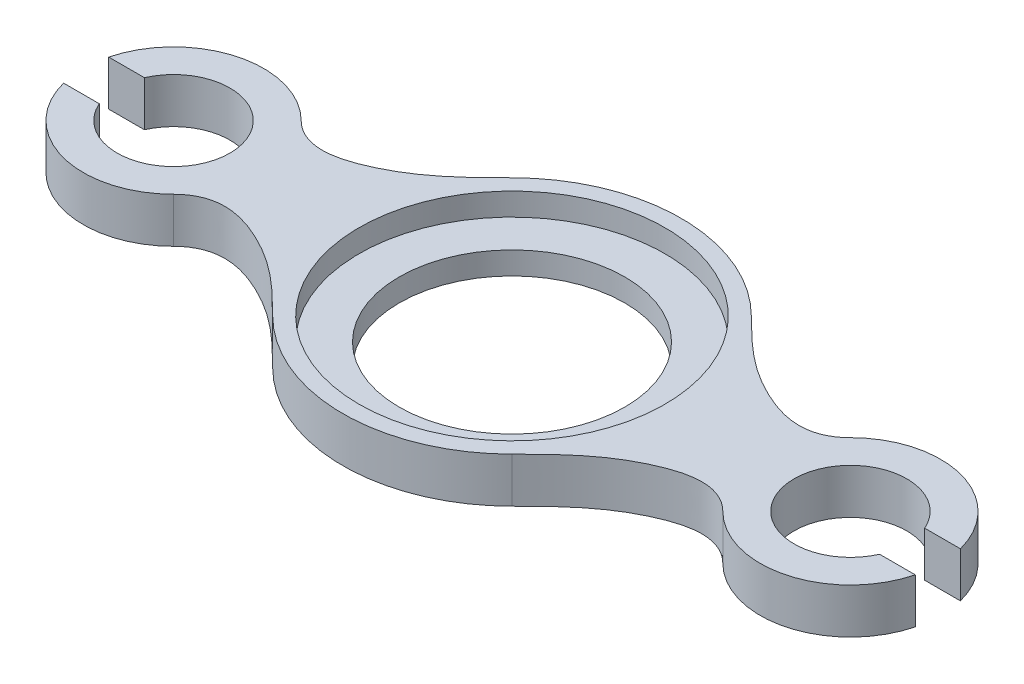
ISO-10303-21;
HEADER;
FILE_DESCRIPTION(('STEP AP214'),'2;1');
FILE_NAME('part.step','',(''),(''),'','','');
FILE_SCHEMA(('AUTOMOTIVE_DESIGN { 1 0 10303 214 1 1 1 1 }'));
ENDSEC;
DATA;
#1=APPLICATION_CONTEXT('core data for automotive mechanical design processes');
#2=APPLICATION_PROTOCOL_DEFINITION('international standard','automotive_design',2000,#1);
#3=PRODUCT_CONTEXT('',#1,'mechanical');
#4=PRODUCT('Part','Part','',(#3));
#5=PRODUCT_RELATED_PRODUCT_CATEGORY('part','',(#4));
#6=PRODUCT_DEFINITION_FORMATION('','',#4);
#7=PRODUCT_DEFINITION_CONTEXT('part definition',#1,'design');
#8=PRODUCT_DEFINITION('design','',#6,#7);
#9=PRODUCT_DEFINITION_SHAPE('','',#8);
#10=(LENGTH_UNIT() NAMED_UNIT(*) SI_UNIT(.MILLI.,.METRE.));
#11=(NAMED_UNIT(*) PLANE_ANGLE_UNIT() SI_UNIT($,.RADIAN.));
#12=(NAMED_UNIT(*) SI_UNIT($,.STERADIAN.) SOLID_ANGLE_UNIT());
#13=UNCERTAINTY_MEASURE_WITH_UNIT(LENGTH_MEASURE(1.E-05),#10,'distance_accuracy_value','');
#14=(GEOMETRIC_REPRESENTATION_CONTEXT(3) GLOBAL_UNCERTAINTY_ASSIGNED_CONTEXT((#13)) GLOBAL_UNIT_ASSIGNED_CONTEXT((#10,
#11,#12)) REPRESENTATION_CONTEXT('',''));
#15=CARTESIAN_POINT('',(0.,0.,0.));
#16=DIRECTION('',(0.,0.,1.));
#17=DIRECTION('',(1.,0.,0.));
#18=AXIS2_PLACEMENT_3D('',#15,#16,#17);
#19=CARTESIAN_POINT('',(150.,0.,0.));
#20=DIRECTION('',(0.,1.,0.));
#21=DIRECTION('',(0.,0.,1.));
#22=AXIS2_PLACEMENT_3D('',#19,#20,#21);
#23=CYLINDRICAL_SURFACE('',#22,40.);
#24=DIRECTION('',(0.,1.,0.));
#25=VECTOR('',#24,1.);
#26=CARTESIAN_POINT('',(188.729833462074,0.,10.0000000000001));
#27=LINE('',#26,#25);
#28=CARTESIAN_POINT('',(188.729833462074,20.,10.0000000000001));
#29=VERTEX_POINT('',#28);
#30=CARTESIAN_POINT('',(188.729833462074,0.,10.0000000000001));
#31=VERTEX_POINT('',#30);
#32=EDGE_CURVE('E259',#29,#31,#27,.F.);
#33=ORIENTED_EDGE('',*,*,#32,.F.);
#34=CARTESIAN_POINT('',(150.,20.,0.));
#35=DIRECTION('',(0.,1.,0.));
#36=DIRECTION('',(0.,0.,1.));
#37=AXIS2_PLACEMENT_3D('',#34,#35,#36);
#38=CIRCLE('',#37,40.);
#39=CARTESIAN_POINT('',(121.715728752538,20.,28.2842712474618));
#40=VERTEX_POINT('',#39);
#41=EDGE_CURVE('E310',#40,#29,#38,.T.);
#42=ORIENTED_EDGE('',*,*,#41,.F.);
#43=DIRECTION('',(0.,1.,0.));
#44=VECTOR('',#43,1.);
#45=CARTESIAN_POINT('',(121.715728752538,0.,28.2842712474618));
#46=LINE('',#45,#44);
#47=CARTESIAN_POINT('',(121.715728752538,0.,28.2842712474618));
#48=VERTEX_POINT('',#47);
#49=EDGE_CURVE('E329',#48,#40,#46,.T.);
#50=ORIENTED_EDGE('',*,*,#49,.F.);
#51=CARTESIAN_POINT('',(150.,0.,0.));
#52=DIRECTION('',(0.,1.,0.));
#53=DIRECTION('',(0.,0.,1.));
#54=AXIS2_PLACEMENT_3D('',#51,#52,#53);
#55=CIRCLE('',#54,40.);
#56=EDGE_CURVE('E370',#48,#31,#55,.T.);
#57=ORIENTED_EDGE('',*,*,#56,.T.);
#58=EDGE_LOOP('',(#33,#42,#50,#57));
#59=FACE_BOUND('',#58,.T.);
#60=ADVANCED_FACE('F40',(#59),#23,.T.);
#61=CARTESIAN_POINT('',(-150.,0.,0.));
#62=DIRECTION('',(0.,1.,0.));
#63=DIRECTION('',(0.,0.,1.));
#64=AXIS2_PLACEMENT_3D('',#61,#62,#63);
#65=CYLINDRICAL_SURFACE('',#64,40.);
#66=CARTESIAN_POINT('',(-150.,20.,0.));
#67=DIRECTION('',(0.,1.,0.));
#68=DIRECTION('',(0.,0.,1.));
#69=AXIS2_PLACEMENT_3D('',#66,#67,#68);
#70=CIRCLE('',#69,40.);
#71=CARTESIAN_POINT('',(-121.715728752538,20.,28.2842712474618));
#72=VERTEX_POINT('',#71);
#73=CARTESIAN_POINT('',(-188.729833462074,20.,10.));
#74=VERTEX_POINT('',#73);
#75=EDGE_CURVE('E288',#72,#74,#70,.F.);
#76=ORIENTED_EDGE('',*,*,#75,.T.);
#77=DIRECTION('',(0.,1.,0.));
#78=VECTOR('',#77,1.);
#79=CARTESIAN_POINT('',(-188.729833462074,0.,10.));
#80=LINE('',#79,#78);
#81=CARTESIAN_POINT('',(-188.729833462074,0.,10.));
#82=VERTEX_POINT('',#81);
#83=EDGE_CURVE('E62',#74,#82,#80,.F.);
#84=ORIENTED_EDGE('',*,*,#83,.T.);
#85=CARTESIAN_POINT('',(-150.,0.,0.));
#86=DIRECTION('',(0.,1.,0.));
#87=DIRECTION('',(0.,0.,1.));
#88=AXIS2_PLACEMENT_3D('',#85,#86,#87);
#89=CIRCLE('',#88,40.);
#90=CARTESIAN_POINT('',(-121.715728752538,0.,28.2842712474618));
#91=VERTEX_POINT('',#90);
#92=EDGE_CURVE('E192',#91,#82,#89,.F.);
#93=ORIENTED_EDGE('',*,*,#92,.F.);
#94=DIRECTION('',(0.,1.,0.));
#95=VECTOR('',#94,1.);
#96=CARTESIAN_POINT('',(-121.715728752538,0.,28.2842712474618));
#97=LINE('',#96,#95);
#98=EDGE_CURVE('E340',#91,#72,#97,.T.);
#99=ORIENTED_EDGE('',*,*,#98,.T.);
#100=EDGE_LOOP('',(#76,#84,#93,#99));
#101=FACE_BOUND('',#100,.T.);
#102=ADVANCED_FACE('F226',(#101),#65,.T.);
#103=CARTESIAN_POINT('',(0.,10.,0.));
#104=DIRECTION('',(0.,1.,0.));
#105=DIRECTION('',(0.,0.,1.));
#106=AXIS2_PLACEMENT_3D('',#103,#104,#105);
#107=PLANE('',#106);
#108=CARTESIAN_POINT('',(0.,10.,0.));
#109=DIRECTION('',(0.,1.,0.));
#110=DIRECTION('',(0.,0.,1.));
#111=AXIS2_PLACEMENT_3D('',#108,#109,#110);
#112=CIRCLE('',#111,67.8);
#113=CARTESIAN_POINT('',(0.,10.,67.8));
#114=VERTEX_POINT('',#113);
#115=EDGE_CURVE('E331',#114,#114,#112,.T.);
#116=ORIENTED_EDGE('',*,*,#115,.T.);
#117=EDGE_LOOP('',(#116));
#118=FACE_BOUND('',#117,.T.);
#119=CARTESIAN_POINT('',(0.,10.,0.));
#120=DIRECTION('',(0.,1.,0.));
#121=DIRECTION('',(0.,0.,1.));
#122=AXIS2_PLACEMENT_3D('',#119,#120,#121);
#123=CIRCLE('',#122,50.);
#124=CARTESIAN_POINT('',(0.,10.,50.));
#125=VERTEX_POINT('',#124);
#126=EDGE_CURVE('E350',#125,#125,#123,.T.);
#127=ORIENTED_EDGE('',*,*,#126,.F.);
#128=EDGE_LOOP('',(#127));
#129=FACE_BOUND('',#128,.T.);
#130=ADVANCED_FACE('F224',(#118,#129),#107,.T.);
#131=CARTESIAN_POINT('',(0.,0.,0.));
#132=DIRECTION('',(0.,1.,0.));
#133=DIRECTION('',(0.,0.,1.));
#134=AXIS2_PLACEMENT_3D('',#131,#132,#133);
#135=PLANE('',#134);
#136=CARTESIAN_POINT('',(0.,0.,0.));
#137=DIRECTION('',(0.,1.,0.));
#138=DIRECTION('',(0.,0.,1.));
#139=AXIS2_PLACEMENT_3D('',#136,#137,#138);
#140=CIRCLE('',#139,50.);
#141=CARTESIAN_POINT('',(0.,0.,50.));
#142=VERTEX_POINT('',#141);
#143=EDGE_CURVE('E349',#142,#142,#140,.T.);
#144=ORIENTED_EDGE('',*,*,#143,.T.);
#145=EDGE_LOOP('',(#144));
#146=FACE_BOUND('',#145,.T.);
#147=ORIENTED_EDGE('',*,*,#92,.T.);
#148=DIRECTION('',(-1.,0.,0.));
#149=VECTOR('',#148,1.);
#150=CARTESIAN_POINT('',(-209.21254798208,0.,10.));
#151=LINE('',#150,#149);
#152=CARTESIAN_POINT('',(-172.912878474779,0.,10.));
#153=VERTEX_POINT('',#152);
#154=EDGE_CURVE('E169',#153,#82,#151,.T.);
#155=ORIENTED_EDGE('',*,*,#154,.F.);
#156=CARTESIAN_POINT('',(-150.,0.,0.));
#157=DIRECTION('',(0.,1.,0.));
#158=DIRECTION('',(0.,0.,1.));
#159=AXIS2_PLACEMENT_3D('',#156,#157,#158);
#160=CIRCLE('',#159,25.);
#161=CARTESIAN_POINT('',(-172.912878474779,0.,-9.99999999999999));
#162=VERTEX_POINT('',#161);
#163=EDGE_CURVE('E176',#162,#153,#160,.F.);
#164=ORIENTED_EDGE('',*,*,#163,.F.);
#165=DIRECTION('',(1.,0.,0.));
#166=VECTOR('',#165,1.);
#167=CARTESIAN_POINT('',(-209.21254798208,0.,-9.99999999999999));
#168=LINE('',#167,#166);
#169=CARTESIAN_POINT('',(-188.729833462074,0.,-9.99999999999999));
#170=VERTEX_POINT('',#169);
#171=EDGE_CURVE('E159',#170,#162,#168,.T.);
#172=ORIENTED_EDGE('',*,*,#171,.F.);
#173=CARTESIAN_POINT('',(-121.715728752538,0.,-28.2842712474618));
#174=VERTEX_POINT('',#173);
#175=EDGE_CURVE('E191',#170,#174,#89,.F.);
#176=ORIENTED_EDGE('',*,*,#175,.T.);
#177=CARTESIAN_POINT('',(-53.033008588991,0.,-53.0330085889912));
#178=CARTESIAN_POINT('',(-65.214190565265,0.,-40.8518266127172));
#179=CARTESIAN_POINT('',(-81.1574059815234,0.,-26.3868897552855));
#180=CARTESIAN_POINT('',(-111.148754797631,0.,-17.7172972925545));
#181=CARTESIAN_POINT('',(-121.715728752538,0.,-28.2842712474618));
#182=B_SPLINE_CURVE_WITH_KNOTS('',3,(#177,#178,#179,#180,#181),.UNSPECIFIED.,.F.,.F.,(4,1,4),
(0.,0.557862636621479,1.),.UNSPECIFIED.);
#183=CARTESIAN_POINT('',(-53.033008588991,0.,-53.0330085889912));
#184=VERTEX_POINT('',#183);
#185=EDGE_CURVE('E179',#184,#174,#182,.T.);
#186=ORIENTED_EDGE('',*,*,#185,.F.);
#187=CARTESIAN_POINT('',(0.,0.,0.));
#188=DIRECTION('',(0.,1.,0.));
#189=DIRECTION('',(0.,0.,1.));
#190=AXIS2_PLACEMENT_3D('',#187,#188,#189);
#191=CIRCLE('',#190,75.);
#192=CARTESIAN_POINT('',(53.033008588991,0.,-53.0330085889912));
#193=VERTEX_POINT('',#192);
#194=EDGE_CURVE('E175',#193,#184,#191,.T.);
#195=ORIENTED_EDGE('',*,*,#194,.F.);
#196=CARTESIAN_POINT('',(53.033008588991,0.,-53.0330085889912));
#197=CARTESIAN_POINT('',(65.214190565265,0.,-40.8518266127172));
#198=CARTESIAN_POINT('',(81.1574059815234,0.,-26.3868897552855));
#199=CARTESIAN_POINT('',(111.148754797631,0.,-17.7172972925545));
#200=CARTESIAN_POINT('',(121.715728752538,0.,-28.2842712474618));
#201=B_SPLINE_CURVE_WITH_KNOTS('',3,(#196,#197,#198,#199,#200),.UNSPECIFIED.,.F.,.F.,(4,1,4),
(0.,0.557862636621479,1.),.UNSPECIFIED.);
#202=CARTESIAN_POINT('',(121.715728752538,0.,-28.2842712474618));
#203=VERTEX_POINT('',#202);
#204=EDGE_CURVE('E347',#193,#203,#201,.T.);
#205=ORIENTED_EDGE('',*,*,#204,.T.);
#206=CARTESIAN_POINT('',(188.729833462074,0.,-9.99999999999994));
#207=VERTEX_POINT('',#206);
#208=EDGE_CURVE('E168',#207,#203,#55,.T.);
#209=ORIENTED_EDGE('',*,*,#208,.F.);
#210=DIRECTION('',(1.,0.,0.));
#211=VECTOR('',#210,1.);
#212=CARTESIAN_POINT('',(209.21254798208,0.,-9.99999999999993));
#213=LINE('',#212,#211);
#214=CARTESIAN_POINT('',(172.912878474779,0.,-9.99999999999994));
#215=VERTEX_POINT('',#214);
#216=EDGE_CURVE('E153',#215,#207,#213,.T.);
#217=ORIENTED_EDGE('',*,*,#216,.F.);
#218=CARTESIAN_POINT('',(150.,0.,0.));
#219=DIRECTION('',(0.,1.,0.));
#220=DIRECTION('',(0.,0.,1.));
#221=AXIS2_PLACEMENT_3D('',#218,#219,#220);
#222=CIRCLE('',#221,25.);
#223=CARTESIAN_POINT('',(172.912878474779,0.,10.0000000000001));
#224=VERTEX_POINT('',#223);
#225=EDGE_CURVE('E166',#215,#224,#222,.T.);
#226=ORIENTED_EDGE('',*,*,#225,.T.);
#227=DIRECTION('',(-1.,0.,0.));
#228=VECTOR('',#227,1.);
#229=CARTESIAN_POINT('',(209.21254798208,0.,10.0000000000001));
#230=LINE('',#229,#228);
#231=EDGE_CURVE('E170',#31,#224,#230,.T.);
#232=ORIENTED_EDGE('',*,*,#231,.F.);
#233=ORIENTED_EDGE('',*,*,#56,.F.);
#234=CARTESIAN_POINT('',(53.033008588991,0.,53.0330085889912));
#235=CARTESIAN_POINT('',(65.214190565265,0.,40.8518266127172));
#236=CARTESIAN_POINT('',(81.1574059815234,0.,26.3868897552855));
#237=CARTESIAN_POINT('',(111.148754797631,0.,17.7172972925545));
#238=CARTESIAN_POINT('',(121.715728752538,0.,28.2842712474618));
#239=B_SPLINE_CURVE_WITH_KNOTS('',3,(#234,#235,#236,#237,#238),.UNSPECIFIED.,.F.,.F.,(4,1,4),
(0.,0.557862636621479,1.),.UNSPECIFIED.);
#240=CARTESIAN_POINT('',(53.033008588991,0.,53.0330085889912));
#241=VERTEX_POINT('',#240);
#242=EDGE_CURVE('E409',#241,#48,#239,.T.);
#243=ORIENTED_EDGE('',*,*,#242,.F.);
#244=CARTESIAN_POINT('',(0.,0.,0.));
#245=DIRECTION('',(0.,1.,0.));
#246=DIRECTION('',(0.,0.,1.));
#247=AXIS2_PLACEMENT_3D('',#244,#245,#246);
#248=CIRCLE('',#247,75.);
#249=CARTESIAN_POINT('',(-53.033008588991,0.,53.0330085889912));
#250=VERTEX_POINT('',#249);
#251=EDGE_CURVE('E416',#250,#241,#248,.T.);
#252=ORIENTED_EDGE('',*,*,#251,.F.);
#253=CARTESIAN_POINT('',(-53.033008588991,0.,53.0330085889912));
#254=CARTESIAN_POINT('',(-65.214190565265,0.,40.8518266127172));
#255=CARTESIAN_POINT('',(-81.1574059815234,0.,26.3868897552855));
#256=CARTESIAN_POINT('',(-111.148754797631,0.,17.7172972925545));
#257=CARTESIAN_POINT('',(-121.715728752538,0.,28.2842712474618));
#258=B_SPLINE_CURVE_WITH_KNOTS('',3,(#253,#254,#255,#256,#257),.UNSPECIFIED.,.F.,.F.,(4,1,4),
(0.,0.557862636621479,1.),.UNSPECIFIED.);
#259=EDGE_CURVE('E417',#250,#91,#258,.T.);
#260=ORIENTED_EDGE('',*,*,#259,.T.);
#261=EDGE_LOOP('',(#147,#155,#164,#172,#176,#186,#195,#205,#209,#217,#226,#232,#233,#243,#252,#260));
#262=FACE_BOUND('',#261,.T.);
#263=ADVANCED_FACE('F42',(#146,#262),#135,.F.);
#264=CARTESIAN_POINT('',(0.,10.,0.));
#265=DIRECTION('',(0.,-1.,0.));
#266=DIRECTION('',(0.,0.,-1.));
#267=AXIS2_PLACEMENT_3D('',#264,#265,#266);
#268=CYLINDRICAL_SURFACE('',#267,50.);
#269=ORIENTED_EDGE('',*,*,#126,.T.);
#270=EDGE_LOOP('',(#269));
#271=FACE_BOUND('',#270,.T.);
#272=ORIENTED_EDGE('',*,*,#143,.F.);
#273=EDGE_LOOP('',(#272));
#274=FACE_BOUND('',#273,.T.);
#275=ADVANCED_FACE('F211',(#271,#274),#268,.F.);
#276=CARTESIAN_POINT('',(0.,0.,0.));
#277=DIRECTION('',(0.,1.,0.));
#278=DIRECTION('',(0.,0.,1.));
#279=AXIS2_PLACEMENT_3D('',#276,#277,#278);
#280=CYLINDRICAL_SURFACE('',#279,75.);
#281=DIRECTION('',(0.,1.,0.));
#282=VECTOR('',#281,1.);
#283=CARTESIAN_POINT('',(-53.033008588991,0.,-53.0330085889912));
#284=LINE('',#283,#282);
#285=CARTESIAN_POINT('',(-53.033008588991,20.,-53.0330085889912));
#286=VERTEX_POINT('',#285);
#287=EDGE_CURVE('E345',#184,#286,#284,.T.);
#288=ORIENTED_EDGE('',*,*,#287,.T.);
#289=CARTESIAN_POINT('',(0.,20.,0.));
#290=DIRECTION('',(0.,1.,0.));
#291=DIRECTION('',(0.,0.,1.));
#292=AXIS2_PLACEMENT_3D('',#289,#290,#291);
#293=CIRCLE('',#292,75.);
#294=CARTESIAN_POINT('',(53.033008588991,20.,-53.0330085889912));
#295=VERTEX_POINT('',#294);
#296=EDGE_CURVE('E279',#295,#286,#293,.T.);
#297=ORIENTED_EDGE('',*,*,#296,.F.);
#298=DIRECTION('',(0.,1.,0.));
#299=VECTOR('',#298,1.);
#300=CARTESIAN_POINT('',(53.033008588991,0.,-53.0330085889912));
#301=LINE('',#300,#299);
#302=EDGE_CURVE('E325',#193,#295,#301,.T.);
#303=ORIENTED_EDGE('',*,*,#302,.F.);
#304=ORIENTED_EDGE('',*,*,#194,.T.);
#305=EDGE_LOOP('',(#288,#297,#303,#304));
#306=FACE_BOUND('',#305,.T.);
#307=ADVANCED_FACE('F207',(#306),#280,.T.);
#308=DIRECTION('',(0.,1.,0.));
#309=VECTOR('',#308,1.);
#310=SURFACE_OF_LINEAR_EXTRUSION('',#201,#309);
#311=ORIENTED_EDGE('',*,*,#302,.T.);
#312=CARTESIAN_POINT('',(53.033008588991,20.,-53.0330085889912));
#313=CARTESIAN_POINT('',(65.214190565265,20.,-40.8518266127172));
#314=CARTESIAN_POINT('',(81.1574059815234,20.,-26.3868897552855));
#315=CARTESIAN_POINT('',(111.148754797631,20.,-17.7172972925545));
#316=CARTESIAN_POINT('',(121.715728752538,20.,-28.2842712474618));
#317=B_SPLINE_CURVE_WITH_KNOTS('',3,(#312,#313,#314,#315,#316),.UNSPECIFIED.,.F.,.F.,(4,1,4),
(0.,0.557862636621479,1.),.UNSPECIFIED.);
#318=CARTESIAN_POINT('',(121.715728752538,20.,-28.2842712474618));
#319=VERTEX_POINT('',#318);
#320=EDGE_CURVE('E182',#295,#319,#317,.T.);
#321=ORIENTED_EDGE('',*,*,#320,.T.);
#322=DIRECTION('',(0.,1.,0.));
#323=VECTOR('',#322,1.);
#324=CARTESIAN_POINT('',(121.715728752538,0.,-28.2842712474618));
#325=LINE('',#324,#323);
#326=EDGE_CURVE('E324',#203,#319,#325,.T.);
#327=ORIENTED_EDGE('',*,*,#326,.F.);
#328=ORIENTED_EDGE('',*,*,#204,.F.);
#329=EDGE_LOOP('',(#311,#321,#327,#328));
#330=FACE_BOUND('',#329,.T.);
#331=ADVANCED_FACE('F210',(#330),#310,.F.);
#332=DIRECTION('',(0.,1.,0.));
#333=VECTOR('',#332,1.);
#334=CARTESIAN_POINT('',(188.729833462074,0.,-9.99999999999994));
#335=LINE('',#334,#333);
#336=CARTESIAN_POINT('',(188.729833462074,20.,-9.99999999999993));
#337=VERTEX_POINT('',#336);
#338=EDGE_CURVE('E55',#207,#337,#335,.T.);
#339=ORIENTED_EDGE('',*,*,#338,.F.);
#340=ORIENTED_EDGE('',*,*,#208,.T.);
#341=ORIENTED_EDGE('',*,*,#326,.T.);
#342=EDGE_CURVE('E257',#337,#319,#38,.T.);
#343=ORIENTED_EDGE('',*,*,#342,.F.);
#344=EDGE_LOOP('',(#339,#340,#341,#343));
#345=FACE_BOUND('',#344,.T.);
#346=ADVANCED_FACE('F239',(#345),#23,.T.);
#347=DIRECTION('',(0.,1.,0.));
#348=VECTOR('',#347,1.);
#349=SURFACE_OF_LINEAR_EXTRUSION('',#239,#348);
#350=ORIENTED_EDGE('',*,*,#49,.T.);
#351=CARTESIAN_POINT('',(53.033008588991,20.,53.0330085889912));
#352=CARTESIAN_POINT('',(65.214190565265,20.,40.8518266127172));
#353=CARTESIAN_POINT('',(81.1574059815234,20.,26.3868897552855));
#354=CARTESIAN_POINT('',(111.148754797631,20.,17.7172972925545));
#355=CARTESIAN_POINT('',(121.715728752538,20.,28.2842712474618));
#356=B_SPLINE_CURVE_WITH_KNOTS('',3,(#351,#352,#353,#354,#355),.UNSPECIFIED.,.F.,.F.,(4,1,4),
(0.,0.557862636621479,1.),.UNSPECIFIED.);
#357=CARTESIAN_POINT('',(53.033008588991,20.,53.0330085889912));
#358=VERTEX_POINT('',#357);
#359=EDGE_CURVE('E305',#358,#40,#356,.T.);
#360=ORIENTED_EDGE('',*,*,#359,.F.);
#361=DIRECTION('',(0.,1.,0.));
#362=VECTOR('',#361,1.);
#363=CARTESIAN_POINT('',(53.033008588991,0.,53.0330085889912));
#364=LINE('',#363,#362);
#365=EDGE_CURVE('E333',#241,#358,#364,.T.);
#366=ORIENTED_EDGE('',*,*,#365,.F.);
#367=ORIENTED_EDGE('',*,*,#242,.T.);
#368=EDGE_LOOP('',(#350,#360,#366,#367));
#369=FACE_BOUND('',#368,.T.);
#370=ADVANCED_FACE('F246',(#369),#349,.T.);
#371=CARTESIAN_POINT('',(0.,0.,0.));
#372=DIRECTION('',(0.,1.,0.));
#373=DIRECTION('',(0.,0.,1.));
#374=AXIS2_PLACEMENT_3D('',#371,#372,#373);
#375=CYLINDRICAL_SURFACE('',#374,75.);
#376=ORIENTED_EDGE('',*,*,#365,.T.);
#377=CARTESIAN_POINT('',(0.,20.,0.));
#378=DIRECTION('',(0.,1.,0.));
#379=DIRECTION('',(0.,0.,1.));
#380=AXIS2_PLACEMENT_3D('',#377,#378,#379);
#381=CIRCLE('',#380,75.);
#382=CARTESIAN_POINT('',(-53.033008588991,20.,53.0330085889912));
#383=VERTEX_POINT('',#382);
#384=EDGE_CURVE('E299',#383,#358,#381,.T.);
#385=ORIENTED_EDGE('',*,*,#384,.F.);
#386=DIRECTION('',(0.,1.,0.));
#387=VECTOR('',#386,1.);
#388=CARTESIAN_POINT('',(-53.033008588991,0.,53.0330085889912));
#389=LINE('',#388,#387);
#390=EDGE_CURVE('E338',#250,#383,#389,.T.);
#391=ORIENTED_EDGE('',*,*,#390,.F.);
#392=ORIENTED_EDGE('',*,*,#251,.T.);
#393=EDGE_LOOP('',(#376,#385,#391,#392));
#394=FACE_BOUND('',#393,.T.);
#395=ADVANCED_FACE('F252',(#394),#375,.T.);
#396=DIRECTION('',(0.,1.,0.));
#397=VECTOR('',#396,1.);
#398=SURFACE_OF_LINEAR_EXTRUSION('',#258,#397);
#399=ORIENTED_EDGE('',*,*,#390,.T.);
#400=CARTESIAN_POINT('',(-53.033008588991,20.,53.0330085889912));
#401=CARTESIAN_POINT('',(-65.214190565265,20.,40.8518266127172));
#402=CARTESIAN_POINT('',(-81.1574059815234,20.,26.3868897552855));
#403=CARTESIAN_POINT('',(-111.148754797631,20.,17.7172972925545));
#404=CARTESIAN_POINT('',(-121.715728752538,20.,28.2842712474618));
#405=B_SPLINE_CURVE_WITH_KNOTS('',3,(#400,#401,#402,#403,#404),.UNSPECIFIED.,.F.,.F.,(4,1,4),
(0.,0.557862636621479,1.),.UNSPECIFIED.);
#406=EDGE_CURVE('E294',#383,#72,#405,.T.);
#407=ORIENTED_EDGE('',*,*,#406,.T.);
#408=ORIENTED_EDGE('',*,*,#98,.F.);
#409=ORIENTED_EDGE('',*,*,#259,.F.);
#410=EDGE_LOOP('',(#399,#407,#408,#409));
#411=FACE_BOUND('',#410,.T.);
#412=ADVANCED_FACE('F427',(#411),#398,.F.);
#413=ORIENTED_EDGE('',*,*,#175,.F.);
#414=DIRECTION('',(0.,1.,0.));
#415=VECTOR('',#414,1.);
#416=CARTESIAN_POINT('',(-188.729833462074,0.,-9.99999999999999));
#417=LINE('',#416,#415);
#418=CARTESIAN_POINT('',(-188.729833462074,20.,-9.99999999999999));
#419=VERTEX_POINT('',#418);
#420=EDGE_CURVE('E265',#170,#419,#417,.T.);
#421=ORIENTED_EDGE('',*,*,#420,.T.);
#422=CARTESIAN_POINT('',(-121.715728752538,20.,-28.2842712474618));
#423=VERTEX_POINT('',#422);
#424=EDGE_CURVE('E287',#419,#423,#70,.F.);
#425=ORIENTED_EDGE('',*,*,#424,.T.);
#426=DIRECTION('',(0.,1.,0.));
#427=VECTOR('',#426,1.);
#428=CARTESIAN_POINT('',(-121.715728752538,0.,-28.2842712474618));
#429=LINE('',#428,#427);
#430=EDGE_CURVE('E342',#174,#423,#429,.T.);
#431=ORIENTED_EDGE('',*,*,#430,.F.);
#432=EDGE_LOOP('',(#413,#421,#425,#431));
#433=FACE_BOUND('',#432,.T.);
#434=ADVANCED_FACE('F205',(#433),#65,.T.);
#435=CARTESIAN_POINT('',(0.,0.,0.));
#436=DIRECTION('',(0.,1.,0.));
#437=DIRECTION('',(0.,0.,1.));
#438=AXIS2_PLACEMENT_3D('',#435,#436,#437);
#439=CYLINDRICAL_SURFACE('',#438,67.8);
#440=ORIENTED_EDGE('',*,*,#115,.F.);
#441=EDGE_LOOP('',(#440));
#442=FACE_BOUND('',#441,.T.);
#443=CARTESIAN_POINT('',(0.,20.,0.));
#444=DIRECTION('',(0.,1.,0.));
#445=DIRECTION('',(0.,0.,1.));
#446=AXIS2_PLACEMENT_3D('',#443,#444,#445);
#447=CIRCLE('',#446,67.8);
#448=CARTESIAN_POINT('',(0.,20.,67.8));
#449=VERTEX_POINT('',#448);
#450=EDGE_CURVE('E276',#449,#449,#447,.T.);
#451=ORIENTED_EDGE('',*,*,#450,.T.);
#452=EDGE_LOOP('',(#451));
#453=FACE_BOUND('',#452,.T.);
#454=ADVANCED_FACE('F213',(#442,#453),#439,.F.);
#455=CARTESIAN_POINT('',(150.,0.,0.));
#456=DIRECTION('',(0.,1.,0.));
#457=DIRECTION('',(0.,0.,1.));
#458=AXIS2_PLACEMENT_3D('',#455,#456,#457);
#459=CYLINDRICAL_SURFACE('',#458,25.);
#460=CARTESIAN_POINT('',(150.,20.,0.));
#461=DIRECTION('',(0.,1.,0.));
#462=DIRECTION('',(0.,0.,1.));
#463=AXIS2_PLACEMENT_3D('',#460,#461,#462);
#464=CIRCLE('',#463,25.);
#465=CARTESIAN_POINT('',(172.912878474779,20.,-9.99999999999994));
#466=VERTEX_POINT('',#465);
#467=CARTESIAN_POINT('',(172.912878474779,20.,10.0000000000001));
#468=VERTEX_POINT('',#467);
#469=EDGE_CURVE('E274',#466,#468,#464,.T.);
#470=ORIENTED_EDGE('',*,*,#469,.T.);
#471=DIRECTION('',(0.,1.,0.));
#472=VECTOR('',#471,1.);
#473=CARTESIAN_POINT('',(172.912878474779,0.,10.0000000000001));
#474=LINE('',#473,#472);
#475=EDGE_CURVE('E174',#468,#224,#474,.F.);
#476=ORIENTED_EDGE('',*,*,#475,.T.);
#477=ORIENTED_EDGE('',*,*,#225,.F.);
#478=DIRECTION('',(0.,1.,0.));
#479=VECTOR('',#478,1.);
#480=CARTESIAN_POINT('',(172.912878474779,0.,-9.99999999999994));
#481=LINE('',#480,#479);
#482=EDGE_CURVE('E150',#215,#466,#481,.T.);
#483=ORIENTED_EDGE('',*,*,#482,.T.);
#484=EDGE_LOOP('',(#470,#476,#477,#483));
#485=FACE_BOUND('',#484,.T.);
#486=ADVANCED_FACE('F173',(#485),#459,.F.);
#487=CARTESIAN_POINT('',(-150.,0.,0.));
#488=DIRECTION('',(0.,1.,0.));
#489=DIRECTION('',(0.,0.,1.));
#490=AXIS2_PLACEMENT_3D('',#487,#488,#489);
#491=CYLINDRICAL_SURFACE('',#490,25.);
#492=DIRECTION('',(0.,1.,0.));
#493=VECTOR('',#492,1.);
#494=CARTESIAN_POINT('',(-172.912878474779,0.,10.));
#495=LINE('',#494,#493);
#496=CARTESIAN_POINT('',(-172.912878474779,20.,10.));
#497=VERTEX_POINT('',#496);
#498=EDGE_CURVE('E268',#497,#153,#495,.F.);
#499=ORIENTED_EDGE('',*,*,#498,.F.);
#500=CARTESIAN_POINT('',(-150.,20.,0.));
#501=DIRECTION('',(0.,1.,0.));
#502=DIRECTION('',(0.,0.,1.));
#503=AXIS2_PLACEMENT_3D('',#500,#501,#502);
#504=CIRCLE('',#503,25.);
#505=CARTESIAN_POINT('',(-172.912878474779,20.,-9.99999999999999));
#506=VERTEX_POINT('',#505);
#507=EDGE_CURVE('E271',#506,#497,#504,.F.);
#508=ORIENTED_EDGE('',*,*,#507,.F.);
#509=DIRECTION('',(0.,1.,0.));
#510=VECTOR('',#509,1.);
#511=CARTESIAN_POINT('',(-172.912878474779,0.,-9.99999999999999));
#512=LINE('',#511,#510);
#513=EDGE_CURVE('E263',#162,#506,#512,.T.);
#514=ORIENTED_EDGE('',*,*,#513,.F.);
#515=ORIENTED_EDGE('',*,*,#163,.T.);
#516=EDGE_LOOP('',(#499,#508,#514,#515));
#517=FACE_BOUND('',#516,.T.);
#518=ADVANCED_FACE('F203',(#517),#491,.F.);
#519=DIRECTION('',(0.,1.,0.));
#520=VECTOR('',#519,1.);
#521=SURFACE_OF_LINEAR_EXTRUSION('',#182,#520);
#522=ORIENTED_EDGE('',*,*,#430,.T.);
#523=CARTESIAN_POINT('',(-53.033008588991,20.,-53.0330085889912));
#524=CARTESIAN_POINT('',(-65.214190565265,20.,-40.8518266127172));
#525=CARTESIAN_POINT('',(-81.1574059815234,20.,-26.3868897552855));
#526=CARTESIAN_POINT('',(-111.148754797631,20.,-17.7172972925545));
#527=CARTESIAN_POINT('',(-121.715728752538,20.,-28.2842712474618));
#528=B_SPLINE_CURVE_WITH_KNOTS('',3,(#523,#524,#525,#526,#527),.UNSPECIFIED.,.F.,.F.,(4,1,4),
(0.,0.557862636621479,1.),.UNSPECIFIED.);
#529=EDGE_CURVE('E282',#286,#423,#528,.T.);
#530=ORIENTED_EDGE('',*,*,#529,.F.);
#531=ORIENTED_EDGE('',*,*,#287,.F.);
#532=ORIENTED_EDGE('',*,*,#185,.T.);
#533=EDGE_LOOP('',(#522,#530,#531,#532));
#534=FACE_BOUND('',#533,.T.);
#535=ADVANCED_FACE('F198',(#534),#521,.T.);
#536=CARTESIAN_POINT('',(0.,20.,0.));
#537=DIRECTION('',(0.,1.,0.));
#538=DIRECTION('',(0.,0.,1.));
#539=AXIS2_PLACEMENT_3D('',#536,#537,#538);
#540=PLANE('',#539);
#541=DIRECTION('',(1.,0.,0.));
#542=VECTOR('',#541,1.);
#543=CARTESIAN_POINT('',(0.,20.,10.));
#544=LINE('',#543,#542);
#545=EDGE_CURVE('E11',#74,#497,#544,.T.);
#546=ORIENTED_EDGE('',*,*,#545,.F.);
#547=ORIENTED_EDGE('',*,*,#75,.F.);
#548=ORIENTED_EDGE('',*,*,#406,.F.);
#549=ORIENTED_EDGE('',*,*,#384,.T.);
#550=ORIENTED_EDGE('',*,*,#359,.T.);
#551=ORIENTED_EDGE('',*,*,#41,.T.);
#552=DIRECTION('',(1.,0.,0.));
#553=VECTOR('',#552,1.);
#554=CARTESIAN_POINT('',(0.,20.,10.0000000000001));
#555=LINE('',#554,#553);
#556=EDGE_CURVE('E356',#468,#29,#555,.T.);
#557=ORIENTED_EDGE('',*,*,#556,.F.);
#558=ORIENTED_EDGE('',*,*,#469,.F.);
#559=DIRECTION('',(-1.,0.,0.));
#560=VECTOR('',#559,1.);
#561=CARTESIAN_POINT('',(0.,20.,-9.99999999999994));
#562=LINE('',#561,#560);
#563=EDGE_CURVE('E154',#337,#466,#562,.T.);
#564=ORIENTED_EDGE('',*,*,#563,.F.);
#565=ORIENTED_EDGE('',*,*,#342,.T.);
#566=ORIENTED_EDGE('',*,*,#320,.F.);
#567=ORIENTED_EDGE('',*,*,#296,.T.);
#568=ORIENTED_EDGE('',*,*,#529,.T.);
#569=ORIENTED_EDGE('',*,*,#424,.F.);
#570=DIRECTION('',(-1.,0.,0.));
#571=VECTOR('',#570,1.);
#572=CARTESIAN_POINT('',(0.,20.,-10.));
#573=LINE('',#572,#571);
#574=EDGE_CURVE('E48',#506,#419,#573,.T.);
#575=ORIENTED_EDGE('',*,*,#574,.F.);
#576=ORIENTED_EDGE('',*,*,#507,.T.);
#577=EDGE_LOOP('',(#546,#547,#548,#549,#550,#551,#557,#558,#564,#565,#566,#567,#568,#569,#575,#576));
#578=FACE_BOUND('',#577,.T.);
#579=ORIENTED_EDGE('',*,*,#450,.F.);
#580=EDGE_LOOP('',(#579));
#581=FACE_BOUND('',#580,.T.);
#582=ADVANCED_FACE('F202',(#578,#581),#540,.T.);
#583=CARTESIAN_POINT('',(209.21254798208,-43.3184487240117,-9.99999999999993));
#584=DIRECTION('',(0.,0.,-1.));
#585=DIRECTION('',(-1.,0.,0.));
#586=AXIS2_PLACEMENT_3D('',#583,#584,#585);
#587=PLANE('',#586);
#588=ORIENTED_EDGE('',*,*,#338,.T.);
#589=ORIENTED_EDGE('',*,*,#563,.T.);
#590=ORIENTED_EDGE('',*,*,#482,.F.);
#591=ORIENTED_EDGE('',*,*,#216,.T.);
#592=EDGE_LOOP('',(#588,#589,#590,#591));
#593=FACE_BOUND('',#592,.T.);
#594=ADVANCED_FACE('F152',(#593),#587,.F.);
#595=CARTESIAN_POINT('',(209.21254798208,-43.3184487240117,10.0000000000001));
#596=DIRECTION('',(0.,0.,1.));
#597=DIRECTION('',(1.,0.,0.));
#598=AXIS2_PLACEMENT_3D('',#595,#596,#597);
#599=PLANE('',#598);
#600=ORIENTED_EDGE('',*,*,#32,.T.);
#601=ORIENTED_EDGE('',*,*,#231,.T.);
#602=ORIENTED_EDGE('',*,*,#475,.F.);
#603=ORIENTED_EDGE('',*,*,#556,.T.);
#604=EDGE_LOOP('',(#600,#601,#602,#603));
#605=FACE_BOUND('',#604,.T.);
#606=ADVANCED_FACE('F385',(#605),#599,.F.);
#607=CARTESIAN_POINT('',(-209.21254798208,-43.3184487240117,-9.99999999999999));
#608=DIRECTION('',(0.,0.,-1.));
#609=DIRECTION('',(-1.,0.,0.));
#610=AXIS2_PLACEMENT_3D('',#607,#608,#609);
#611=PLANE('',#610);
#612=ORIENTED_EDGE('',*,*,#171,.T.);
#613=ORIENTED_EDGE('',*,*,#513,.T.);
#614=ORIENTED_EDGE('',*,*,#574,.T.);
#615=ORIENTED_EDGE('',*,*,#420,.F.);
#616=EDGE_LOOP('',(#612,#613,#614,#615));
#617=FACE_BOUND('',#616,.T.);
#618=ADVANCED_FACE('F359',(#617),#611,.F.);
#619=CARTESIAN_POINT('',(-209.21254798208,-43.3184487240117,10.));
#620=DIRECTION('',(0.,0.,1.));
#621=DIRECTION('',(1.,0.,0.));
#622=AXIS2_PLACEMENT_3D('',#619,#620,#621);
#623=PLANE('',#622);
#624=ORIENTED_EDGE('',*,*,#545,.T.);
#625=ORIENTED_EDGE('',*,*,#498,.T.);
#626=ORIENTED_EDGE('',*,*,#154,.T.);
#627=ORIENTED_EDGE('',*,*,#83,.F.);
#628=EDGE_LOOP('',(#624,#625,#626,#627));
#629=FACE_BOUND('',#628,.T.);
#630=ADVANCED_FACE('F391',(#629),#623,.F.);
#631=CLOSED_SHELL('',(#60,#102,#130,#263,#275,#307,#331,#346,#370,#395,#412,#434,#454,#486,#518,
#535,#582,#594,#606,#618,#630));
#632=MANIFOLD_SOLID_BREP('B2',#631);
#633=ADVANCED_BREP_SHAPE_REPRESENTATION('',(#18,#632),#14);
#634=SHAPE_DEFINITION_REPRESENTATION(#9,#633);
ENDSEC;
END-ISO-10303-21;
